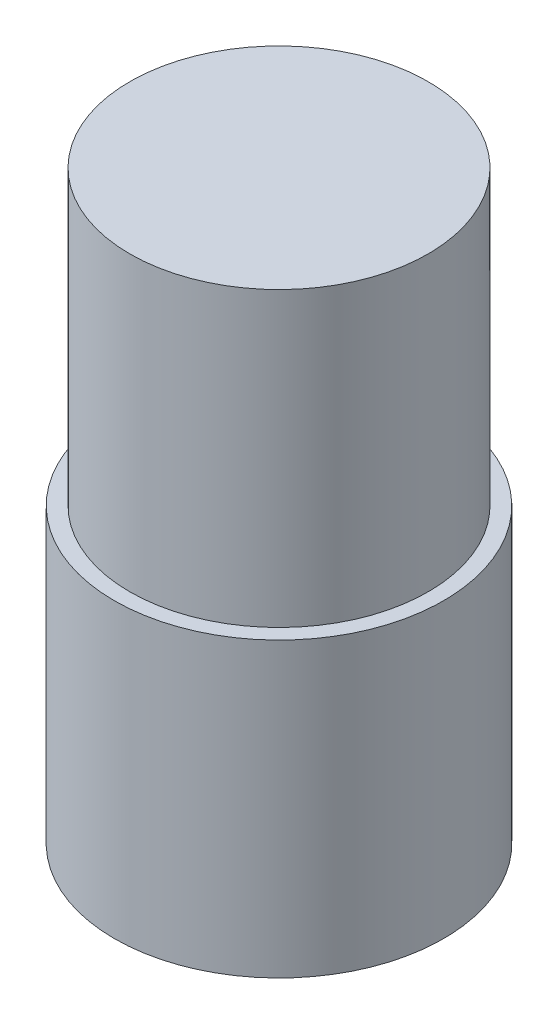
ISO-10303-21;
HEADER;
FILE_DESCRIPTION(('STEP AP214'),'2;1');
FILE_NAME('part.step','',(''),(''),'','','');
FILE_SCHEMA(('AUTOMOTIVE_DESIGN { 1 0 10303 214 1 1 1 1 }'));
ENDSEC;
DATA;
#1=APPLICATION_CONTEXT('core data for automotive mechanical design processes');
#2=APPLICATION_PROTOCOL_DEFINITION('international standard','automotive_design',2000,#1);
#3=PRODUCT_CONTEXT('',#1,'mechanical');
#4=PRODUCT('Part','Part','',(#3));
#5=PRODUCT_RELATED_PRODUCT_CATEGORY('part','',(#4));
#6=PRODUCT_DEFINITION_FORMATION('','',#4);
#7=PRODUCT_DEFINITION_CONTEXT('part definition',#1,'design');
#8=PRODUCT_DEFINITION('design','',#6,#7);
#9=PRODUCT_DEFINITION_SHAPE('','',#8);
#10=(LENGTH_UNIT() NAMED_UNIT(*) SI_UNIT(.MILLI.,.METRE.));
#11=(NAMED_UNIT(*) PLANE_ANGLE_UNIT() SI_UNIT($,.RADIAN.));
#12=(NAMED_UNIT(*) SI_UNIT($,.STERADIAN.) SOLID_ANGLE_UNIT());
#13=UNCERTAINTY_MEASURE_WITH_UNIT(LENGTH_MEASURE(1.E-05),#10,'distance_accuracy_value','');
#14=(GEOMETRIC_REPRESENTATION_CONTEXT(3) GLOBAL_UNCERTAINTY_ASSIGNED_CONTEXT((#13)) GLOBAL_UNIT_ASSIGNED_CONTEXT((#10,
#11,#12)) REPRESENTATION_CONTEXT('',''));
#15=CARTESIAN_POINT('',(0.,0.,0.));
#16=DIRECTION('',(0.,0.,1.));
#17=DIRECTION('',(1.,0.,0.));
#18=AXIS2_PLACEMENT_3D('',#15,#16,#17);
#19=CARTESIAN_POINT('',(0.,25.4,0.));
#20=DIRECTION('',(0.,-1.,0.));
#21=DIRECTION('',(0.,0.,-1.));
#22=AXIS2_PLACEMENT_3D('',#19,#20,#21);
#23=CYLINDRICAL_SURFACE('',#22,7.14375);
#24=CARTESIAN_POINT('',(0.,0.,0.));
#25=DIRECTION('',(0.,1.,0.));
#26=DIRECTION('',(0.,0.,1.));
#27=AXIS2_PLACEMENT_3D('',#24,#25,#26);
#28=CIRCLE('',#27,7.14375);
#29=CARTESIAN_POINT('',(0.,0.,7.14375000000003));
#30=VERTEX_POINT('',#29);
#31=EDGE_CURVE('E10',#30,#30,#28,.T.);
#32=ORIENTED_EDGE('',*,*,#31,.T.);
#33=EDGE_LOOP('',(#32));
#34=FACE_BOUND('',#33,.T.);
#35=CARTESIAN_POINT('',(0.,12.7,0.));
#36=DIRECTION('',(0.,1.,0.));
#37=DIRECTION('',(0.,0.,1.));
#38=AXIS2_PLACEMENT_3D('',#35,#36,#37);
#39=CIRCLE('',#38,7.14375);
#40=CARTESIAN_POINT('',(0.,12.7,7.14375000000003));
#41=VERTEX_POINT('',#40);
#42=EDGE_CURVE('E35',#41,#41,#39,.T.);
#43=ORIENTED_EDGE('',*,*,#42,.F.);
#44=EDGE_LOOP('',(#43));
#45=FACE_BOUND('',#44,.T.);
#46=ADVANCED_FACE('F32',(#34,#45),#23,.T.);
#47=CARTESIAN_POINT('',(0.,0.,0.));
#48=DIRECTION('',(0.,1.,0.));
#49=DIRECTION('',(0.,0.,1.));
#50=AXIS2_PLACEMENT_3D('',#47,#48,#49);
#51=PLANE('',#50);
#52=ORIENTED_EDGE('',*,*,#31,.F.);
#53=EDGE_LOOP('',(#52));
#54=FACE_BOUND('',#53,.T.);
#55=ADVANCED_FACE('F56',(#54),#51,.F.);
#56=CARTESIAN_POINT('',(0.,12.7,0.));
#57=DIRECTION('',(0.,1.,0.));
#58=DIRECTION('',(0.,0.,1.));
#59=AXIS2_PLACEMENT_3D('',#56,#57,#58);
#60=PLANE('',#59);
#61=CARTESIAN_POINT('',(0.,12.7,0.));
#62=DIRECTION('',(0.,1.,0.));
#63=DIRECTION('',(0.,0.,1.));
#64=AXIS2_PLACEMENT_3D('',#61,#62,#63);
#65=CIRCLE('',#64,6.475);
#66=CARTESIAN_POINT('',(0.,12.7,6.47500000000003));
#67=VERTEX_POINT('',#66);
#68=EDGE_CURVE('E42',#67,#67,#65,.T.);
#69=ORIENTED_EDGE('',*,*,#68,.F.);
#70=EDGE_LOOP('',(#69));
#71=FACE_BOUND('',#70,.T.);
#72=ORIENTED_EDGE('',*,*,#42,.T.);
#73=EDGE_LOOP('',(#72));
#74=FACE_BOUND('',#73,.T.);
#75=ADVANCED_FACE('F53',(#71,#74),#60,.T.);
#76=CARTESIAN_POINT('',(0.,12.7,0.));
#77=DIRECTION('',(0.,1.,0.));
#78=DIRECTION('',(0.,0.,1.));
#79=AXIS2_PLACEMENT_3D('',#76,#77,#78);
#80=CYLINDRICAL_SURFACE('',#79,6.475);
#81=ORIENTED_EDGE('',*,*,#68,.T.);
#82=EDGE_LOOP('',(#81));
#83=FACE_BOUND('',#82,.T.);
#84=CARTESIAN_POINT('',(0.,25.4,0.));
#85=DIRECTION('',(0.,1.,0.));
#86=DIRECTION('',(0.,0.,1.));
#87=AXIS2_PLACEMENT_3D('',#84,#85,#86);
#88=CIRCLE('',#87,6.475);
#89=CARTESIAN_POINT('',(0.,25.4,6.47500000000003));
#90=VERTEX_POINT('',#89);
#91=EDGE_CURVE('E44',#90,#90,#88,.T.);
#92=ORIENTED_EDGE('',*,*,#91,.F.);
#93=EDGE_LOOP('',(#92));
#94=FACE_BOUND('',#93,.T.);
#95=ADVANCED_FACE('F50',(#83,#94),#80,.T.);
#96=CARTESIAN_POINT('',(0.,25.4,0.));
#97=DIRECTION('',(0.,1.,0.));
#98=DIRECTION('',(0.,0.,1.));
#99=AXIS2_PLACEMENT_3D('',#96,#97,#98);
#100=PLANE('',#99);
#101=ORIENTED_EDGE('',*,*,#91,.T.);
#102=EDGE_LOOP('',(#101));
#103=FACE_BOUND('',#102,.T.);
#104=ADVANCED_FACE('F68',(#103),#100,.T.);
#105=CLOSED_SHELL('',(#46,#55,#75,#95,#104));
#106=MANIFOLD_SOLID_BREP('B2',#105);
#107=ADVANCED_BREP_SHAPE_REPRESENTATION('',(#18,#106),#14);
#108=SHAPE_DEFINITION_REPRESENTATION(#9,#107);
ENDSEC;
END-ISO-10303-21;
